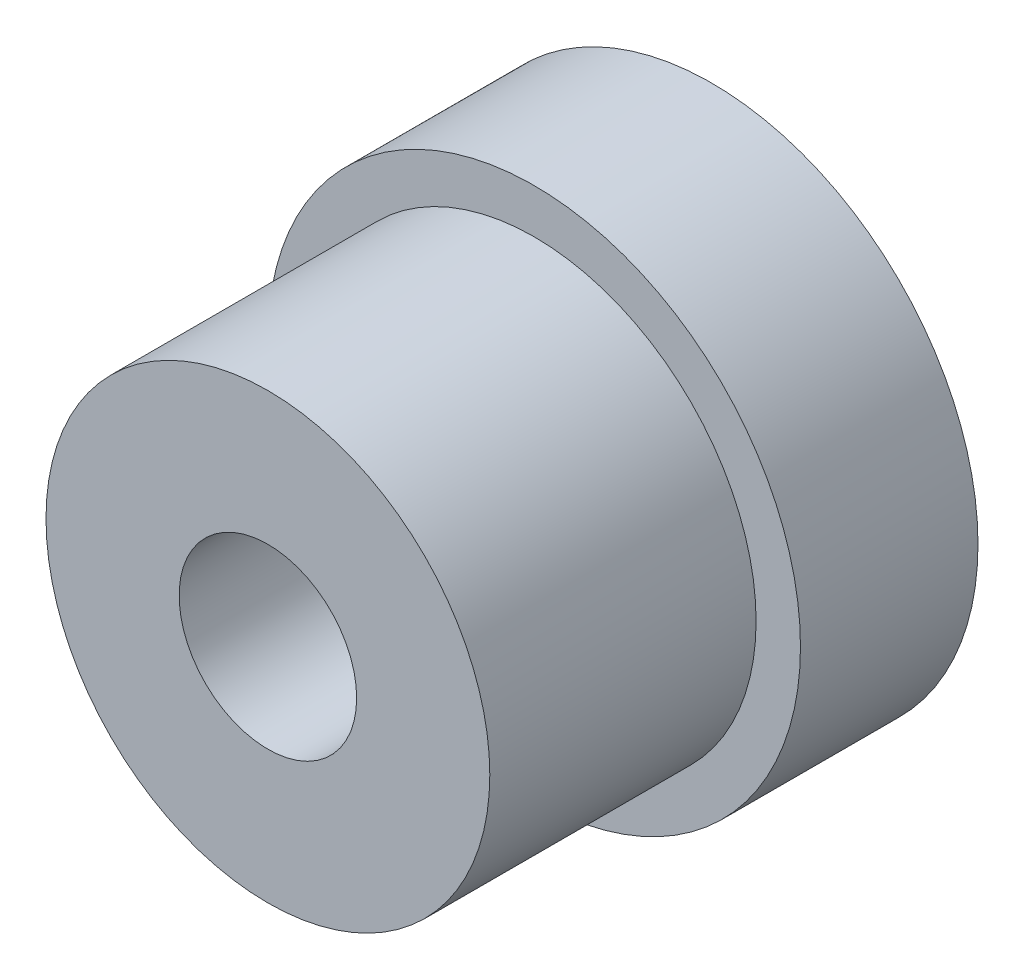
ISO-10303-21;
HEADER;
FILE_DESCRIPTION(('STEP AP214'),'2;1');
FILE_NAME('part.step','',(''),(''),'','','');
FILE_SCHEMA(('AUTOMOTIVE_DESIGN { 1 0 10303 214 1 1 1 1 }'));
ENDSEC;
DATA;
#1=APPLICATION_CONTEXT('core data for automotive mechanical design processes');
#2=APPLICATION_PROTOCOL_DEFINITION('international standard','automotive_design',2000,#1);
#3=PRODUCT_CONTEXT('',#1,'mechanical');
#4=PRODUCT('Part','Part','',(#3));
#5=PRODUCT_RELATED_PRODUCT_CATEGORY('part','',(#4));
#6=PRODUCT_DEFINITION_FORMATION('','',#4);
#7=PRODUCT_DEFINITION_CONTEXT('part definition',#1,'design');
#8=PRODUCT_DEFINITION('design','',#6,#7);
#9=PRODUCT_DEFINITION_SHAPE('','',#8);
#10=(LENGTH_UNIT() NAMED_UNIT(*) SI_UNIT(.MILLI.,.METRE.));
#11=(NAMED_UNIT(*) PLANE_ANGLE_UNIT() SI_UNIT($,.RADIAN.));
#12=(NAMED_UNIT(*) SI_UNIT($,.STERADIAN.) SOLID_ANGLE_UNIT());
#13=UNCERTAINTY_MEASURE_WITH_UNIT(LENGTH_MEASURE(1.E-05),#10,'distance_accuracy_value','');
#14=(GEOMETRIC_REPRESENTATION_CONTEXT(3) GLOBAL_UNCERTAINTY_ASSIGNED_CONTEXT((#13)) GLOBAL_UNIT_ASSIGNED_CONTEXT((#10,
#11,#12)) REPRESENTATION_CONTEXT('',''));
#15=CARTESIAN_POINT('',(0.,0.,0.));
#16=DIRECTION('',(0.,0.,1.));
#17=DIRECTION('',(1.,0.,0.));
#18=AXIS2_PLACEMENT_3D('',#15,#16,#17);
#19=CARTESIAN_POINT('',(0.,0.,3.175));
#20=DIRECTION('',(0.,0.,-1.));
#21=DIRECTION('',(-1.,0.,0.));
#22=AXIS2_PLACEMENT_3D('',#19,#20,#21);
#23=CYLINDRICAL_SURFACE('',#22,4.7625);
#24=CARTESIAN_POINT('',(0.,0.,3.175));
#25=DIRECTION('',(0.,0.,1.));
#26=DIRECTION('',(1.,0.,0.));
#27=AXIS2_PLACEMENT_3D('',#24,#25,#26);
#28=CIRCLE('',#27,4.7625);
#29=CARTESIAN_POINT('',(4.7625,0.,3.175));
#30=VERTEX_POINT('',#29);
#31=EDGE_CURVE('E10',#30,#30,#28,.T.);
#32=ORIENTED_EDGE('',*,*,#31,.F.);
#33=EDGE_LOOP('',(#32));
#34=FACE_BOUND('',#33,.T.);
#35=CARTESIAN_POINT('',(0.,0.,0.));
#36=DIRECTION('',(0.,0.,1.));
#37=DIRECTION('',(1.,0.,0.));
#38=AXIS2_PLACEMENT_3D('',#35,#36,#37);
#39=CIRCLE('',#38,4.7625);
#40=CARTESIAN_POINT('',(4.7625,0.,0.));
#41=VERTEX_POINT('',#40);
#42=EDGE_CURVE('E35',#41,#41,#39,.T.);
#43=ORIENTED_EDGE('',*,*,#42,.T.);
#44=EDGE_LOOP('',(#43));
#45=FACE_BOUND('',#44,.T.);
#46=ADVANCED_FACE('F32',(#34,#45),#23,.T.);
#47=CARTESIAN_POINT('',(0.,0.,3.175));
#48=DIRECTION('',(0.,0.,1.));
#49=DIRECTION('',(1.,0.,0.));
#50=AXIS2_PLACEMENT_3D('',#47,#48,#49);
#51=PLANE('',#50);
#52=CARTESIAN_POINT('',(0.,0.,3.175));
#53=DIRECTION('',(0.,0.,1.));
#54=DIRECTION('',(1.,0.,0.));
#55=AXIS2_PLACEMENT_3D('',#52,#53,#54);
#56=CIRCLE('',#55,3.96875);
#57=CARTESIAN_POINT('',(-3.96875,0.,3.175));
#58=VERTEX_POINT('',#57);
#59=EDGE_CURVE('E44',#58,#58,#56,.T.);
#60=ORIENTED_EDGE('',*,*,#59,.F.);
#61=EDGE_LOOP('',(#60));
#62=FACE_BOUND('',#61,.T.);
#63=ORIENTED_EDGE('',*,*,#31,.T.);
#64=EDGE_LOOP('',(#63));
#65=FACE_BOUND('',#64,.T.);
#66=ADVANCED_FACE('F77',(#62,#65),#51,.T.);
#67=CARTESIAN_POINT('',(0.,0.,0.));
#68=DIRECTION('',(0.,0.,1.));
#69=DIRECTION('',(1.,0.,0.));
#70=AXIS2_PLACEMENT_3D('',#67,#68,#69);
#71=PLANE('',#70);
#72=CARTESIAN_POINT('',(0.,0.,0.));
#73=DIRECTION('',(0.,0.,1.));
#74=DIRECTION('',(1.,0.,0.));
#75=AXIS2_PLACEMENT_3D('',#72,#73,#74);
#76=CIRCLE('',#75,1.5875);
#77=CARTESIAN_POINT('',(1.5875,0.,0.));
#78=VERTEX_POINT('',#77);
#79=EDGE_CURVE('E47',#78,#78,#76,.T.);
#80=ORIENTED_EDGE('',*,*,#79,.T.);
#81=EDGE_LOOP('',(#80));
#82=FACE_BOUND('',#81,.T.);
#83=ORIENTED_EDGE('',*,*,#42,.F.);
#84=EDGE_LOOP('',(#83));
#85=FACE_BOUND('',#84,.T.);
#86=ADVANCED_FACE('F56',(#82,#85),#71,.F.);
#87=CARTESIAN_POINT('',(0.,0.,7.9375));
#88=DIRECTION('',(0.,0.,-1.));
#89=DIRECTION('',(-1.,0.,0.));
#90=AXIS2_PLACEMENT_3D('',#87,#88,#89);
#91=CYLINDRICAL_SURFACE('',#90,3.96875);
#92=CARTESIAN_POINT('',(0.,0.,7.9375));
#93=DIRECTION('',(0.,0.,1.));
#94=DIRECTION('',(1.,0.,0.));
#95=AXIS2_PLACEMENT_3D('',#92,#93,#94);
#96=CIRCLE('',#95,3.96875);
#97=CARTESIAN_POINT('',(-3.96875,0.,7.9375));
#98=VERTEX_POINT('',#97);
#99=EDGE_CURVE('E42',#98,#98,#96,.T.);
#100=CARTESIAN_POINT('',(-3.96875,0.,7.9375));
#101=CARTESIAN_POINT('',(-3.96875,0.,7.887890625));
#102=CARTESIAN_POINT('',(-3.96875,0.,7.83828125));
#103=CARTESIAN_POINT('',(-3.96875,0.,7.7390625));
#104=CARTESIAN_POINT('',(-3.96875,0.,7.689453125));
#105=CARTESIAN_POINT('',(-3.96875,0.,7.590234375));
#106=CARTESIAN_POINT('',(-3.96875,0.,7.540625));
#107=CARTESIAN_POINT('',(-3.96875,0.,7.44140625));
#108=CARTESIAN_POINT('',(-3.96875,0.,7.391796875));
#109=CARTESIAN_POINT('',(-3.96875,0.,7.292578125));
#110=CARTESIAN_POINT('',(-3.96875,0.,7.24296875));
#111=CARTESIAN_POINT('',(-3.96875,0.,7.14375));
#112=CARTESIAN_POINT('',(-3.96875,0.,7.094140625));
#113=CARTESIAN_POINT('',(-3.96875,0.,6.994921875));
#114=CARTESIAN_POINT('',(-3.96875,0.,6.9453125));
#115=CARTESIAN_POINT('',(-3.96875,0.,6.84609375));
#116=CARTESIAN_POINT('',(-3.96875,0.,6.796484375));
#117=CARTESIAN_POINT('',(-3.96875,0.,6.697265625));
#118=CARTESIAN_POINT('',(-3.96875,0.,6.64765625));
#119=CARTESIAN_POINT('',(-3.96875,0.,6.5484375));
#120=CARTESIAN_POINT('',(-3.96875,0.,6.498828125));
#121=CARTESIAN_POINT('',(-3.96875,0.,6.399609375));
#122=CARTESIAN_POINT('',(-3.96875,0.,6.35));
#123=CARTESIAN_POINT('',(-3.96875,0.,6.25078125));
#124=CARTESIAN_POINT('',(-3.96875,0.,6.201171875));
#125=CARTESIAN_POINT('',(-3.96875,0.,6.101953125));
#126=CARTESIAN_POINT('',(-3.96875,0.,6.05234375));
#127=CARTESIAN_POINT('',(-3.96875,0.,5.953125));
#128=CARTESIAN_POINT('',(-3.96875,0.,5.903515625));
#129=CARTESIAN_POINT('',(-3.96875,0.,5.804296875));
#130=CARTESIAN_POINT('',(-3.96875,0.,5.7546875));
#131=CARTESIAN_POINT('',(-3.96875,0.,5.65546875));
#132=CARTESIAN_POINT('',(-3.96875,0.,5.605859375));
#133=CARTESIAN_POINT('',(-3.96875,0.,5.506640625));
#134=CARTESIAN_POINT('',(-3.96875,0.,5.45703125));
#135=CARTESIAN_POINT('',(-3.96875,0.,5.3578125));
#136=CARTESIAN_POINT('',(-3.96875,0.,5.308203125));
#137=CARTESIAN_POINT('',(-3.96875,0.,5.208984375));
#138=CARTESIAN_POINT('',(-3.96875,0.,5.159375));
#139=CARTESIAN_POINT('',(-3.96875,0.,5.06015625));
#140=CARTESIAN_POINT('',(-3.96875,0.,5.010546875));
#141=CARTESIAN_POINT('',(-3.96875,0.,4.911328125));
#142=CARTESIAN_POINT('',(-3.96875,0.,4.86171875));
#143=CARTESIAN_POINT('',(-3.96875,0.,4.7625));
#144=CARTESIAN_POINT('',(-3.96875,0.,4.712890625));
#145=CARTESIAN_POINT('',(-3.96875,0.,4.613671875));
#146=CARTESIAN_POINT('',(-3.96875,0.,4.5640625));
#147=CARTESIAN_POINT('',(-3.96875,0.,4.46484375));
#148=CARTESIAN_POINT('',(-3.96875,0.,4.415234375));
#149=CARTESIAN_POINT('',(-3.96875,0.,4.316015625));
#150=CARTESIAN_POINT('',(-3.96875,0.,4.26640625));
#151=CARTESIAN_POINT('',(-3.96875,0.,4.1671875));
#152=CARTESIAN_POINT('',(-3.96875,0.,4.117578125));
#153=CARTESIAN_POINT('',(-3.96875,0.,4.018359375));
#154=CARTESIAN_POINT('',(-3.96875,0.,3.96875));
#155=CARTESIAN_POINT('',(-3.96875,0.,3.86953125));
#156=CARTESIAN_POINT('',(-3.96875,0.,3.819921875));
#157=CARTESIAN_POINT('',(-3.96875,0.,3.720703125));
#158=CARTESIAN_POINT('',(-3.96875,0.,3.67109375));
#159=CARTESIAN_POINT('',(-3.96875,0.,3.571875));
#160=CARTESIAN_POINT('',(-3.96875,0.,3.522265625));
#161=CARTESIAN_POINT('',(-3.96875,0.,3.423046875));
#162=CARTESIAN_POINT('',(-3.96875,0.,3.3734375));
#163=CARTESIAN_POINT('',(-3.96875,0.,3.27421875));
#164=CARTESIAN_POINT('',(-3.96875,0.,3.224609375));
#165=CARTESIAN_POINT('',(-3.96875,0.,3.175));
#166=B_SPLINE_CURVE_WITH_KNOTS('',3,(#100,#101,#102,#103,#104,#105,#106,#107,#108,#109,#110,
#111,#112,#113,#114,#115,#116,#117,#118,#119,#120,#121,#122,#123,#124,#125,#126,#127,#128,#129,
#130,#131,#132,#133,#134,#135,#136,#137,#138,#139,#140,#141,#142,#143,#144,#145,#146,#147,#148,
#149,#150,#151,#152,#153,#154,#155,#156,#157,#158,#159,#160,#161,#162,#163,#164,#165),
.UNSPECIFIED.,.F.,.F.,(4,2,2,2,2,2,2,2,2,2,2,2,2,2,2,2,2,2,2,2,2,2,2,2,2,2,2,2,2,2,2,2,4),(0.,
0.148828124999999,0.297656249999999,0.446484374999999,0.595312499999999,0.744140624999999,
0.892968749999999,1.041796875,1.190625,1.339453125,1.48828125,1.637109375,1.7859375,1.934765625,
2.08359375,2.232421875,2.38125,2.530078125,2.67890625,2.827734375,2.9765625,3.125390625,
3.27421875,3.423046875,3.571875,3.720703125,3.86953125,4.018359375,4.1671875,4.316015625,
4.46484375,4.613671875,4.7625),.UNSPECIFIED.);
#167=EDGE_CURVE('BSEAM68',#98,#58,#166,.T.);
#168=ORIENTED_EDGE('',*,*,#99,.F.);
#169=ORIENTED_EDGE('',*,*,#59,.T.);
#170=ORIENTED_EDGE('',*,*,#167,.T.);
#171=ORIENTED_EDGE('',*,*,#167,.F.);
#172=EDGE_LOOP('',(#168,#170,#169,#171));
#173=FACE_BOUND('',#172,.T.);
#174=ADVANCED_FACE('F68',(#173),#91,.T.);
#175=CARTESIAN_POINT('',(0.,0.,7.9375));
#176=DIRECTION('',(0.,0.,1.));
#177=DIRECTION('',(1.,0.,0.));
#178=AXIS2_PLACEMENT_3D('',#175,#176,#177);
#179=PLANE('',#178);
#180=CARTESIAN_POINT('',(0.,0.,7.9375));
#181=DIRECTION('',(0.,0.,1.));
#182=DIRECTION('',(1.,0.,0.));
#183=AXIS2_PLACEMENT_3D('',#180,#181,#182);
#184=CIRCLE('',#183,1.5875);
#185=CARTESIAN_POINT('',(1.5875,0.,7.9375));
#186=VERTEX_POINT('',#185);
#187=EDGE_CURVE('E50',#186,#186,#184,.T.);
#188=ORIENTED_EDGE('',*,*,#187,.F.);
#189=EDGE_LOOP('',(#188));
#190=FACE_BOUND('',#189,.T.);
#191=ORIENTED_EDGE('',*,*,#99,.T.);
#192=EDGE_LOOP('',(#191));
#193=FACE_BOUND('',#192,.T.);
#194=ADVANCED_FACE('F62',(#190,#193),#179,.T.);
#195=CARTESIAN_POINT('',(0.,0.,0.));
#196=DIRECTION('',(0.,0.,1.));
#197=DIRECTION('',(1.,0.,0.));
#198=AXIS2_PLACEMENT_3D('',#195,#196,#197);
#199=CYLINDRICAL_SURFACE('',#198,1.5875);
#200=ORIENTED_EDGE('',*,*,#79,.F.);
#201=EDGE_LOOP('',(#200));
#202=FACE_BOUND('',#201,.T.);
#203=ORIENTED_EDGE('',*,*,#187,.T.);
#204=EDGE_LOOP('',(#203));
#205=FACE_BOUND('',#204,.T.);
#206=ADVANCED_FACE('F59',(#202,#205),#199,.F.);
#207=CLOSED_SHELL('',(#46,#66,#86,#174,#194,#206));
#208=MANIFOLD_SOLID_BREP('B2',#207);
#209=ADVANCED_BREP_SHAPE_REPRESENTATION('',(#18,#208),#14);
#210=SHAPE_DEFINITION_REPRESENTATION(#9,#209);
ENDSEC;
END-ISO-10303-21;
